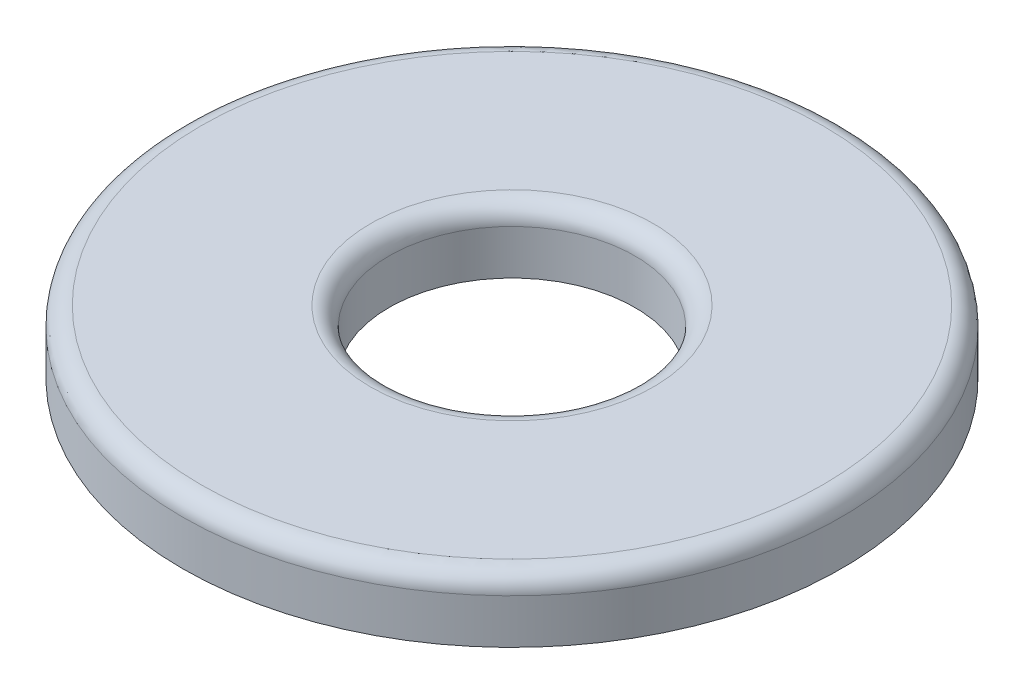
ISO-10303-21;
HEADER;
FILE_DESCRIPTION(('STEP AP214'),'2;1');
FILE_NAME('part.step','',(''),(''),'','','');
FILE_SCHEMA(('AUTOMOTIVE_DESIGN { 1 0 10303 214 1 1 1 1 }'));
ENDSEC;
DATA;
#1=APPLICATION_CONTEXT('core data for automotive mechanical design processes');
#2=APPLICATION_PROTOCOL_DEFINITION('international standard','automotive_design',2000,#1);
#3=PRODUCT_CONTEXT('',#1,'mechanical');
#4=PRODUCT('Part','Part','',(#3));
#5=PRODUCT_RELATED_PRODUCT_CATEGORY('part','',(#4));
#6=PRODUCT_DEFINITION_FORMATION('','',#4);
#7=PRODUCT_DEFINITION_CONTEXT('part definition',#1,'design');
#8=PRODUCT_DEFINITION('design','',#6,#7);
#9=PRODUCT_DEFINITION_SHAPE('','',#8);
#10=(LENGTH_UNIT() NAMED_UNIT(*) SI_UNIT(.MILLI.,.METRE.));
#11=(NAMED_UNIT(*) PLANE_ANGLE_UNIT() SI_UNIT($,.RADIAN.));
#12=(NAMED_UNIT(*) SI_UNIT($,.STERADIAN.) SOLID_ANGLE_UNIT());
#13=UNCERTAINTY_MEASURE_WITH_UNIT(LENGTH_MEASURE(1.E-05),#10,'distance_accuracy_value','');
#14=(GEOMETRIC_REPRESENTATION_CONTEXT(3) GLOBAL_UNCERTAINTY_ASSIGNED_CONTEXT((#13)) GLOBAL_UNIT_ASSIGNED_CONTEXT((#10,
#11,#12)) REPRESENTATION_CONTEXT('',''));
#15=CARTESIAN_POINT('',(0.,0.,0.));
#16=DIRECTION('',(0.,0.,1.));
#17=DIRECTION('',(1.,0.,0.));
#18=AXIS2_PLACEMENT_3D('',#15,#16,#17);
#19=CARTESIAN_POINT('',(0.,2.18452943826526,0.));
#20=DIRECTION('',(0.,1.,0.));
#21=DIRECTION('',(0.,0.,1.));
#22=AXIS2_PLACEMENT_3D('',#19,#20,#21);
#23=CYLINDRICAL_SURFACE('',#22,4.425);
#24=CARTESIAN_POINT('',(0.,0.600000000000001,0.));
#25=DIRECTION('',(0.,1.,0.));
#26=DIRECTION('',(0.,0.,1.));
#27=AXIS2_PLACEMENT_3D('',#24,#25,#26);
#28=CIRCLE('',#27,4.425);
#29=CARTESIAN_POINT('',(0.,0.600000000000001,4.425));
#30=VERTEX_POINT('',#29);
#31=EDGE_CURVE('E10',#30,#30,#28,.T.);
#32=ORIENTED_EDGE('',*,*,#31,.F.);
#33=EDGE_LOOP('',(#32));
#34=FACE_BOUND('',#33,.T.);
#35=CARTESIAN_POINT('',(0.,0.,0.));
#36=DIRECTION('',(0.,1.,0.));
#37=DIRECTION('',(0.,0.,1.));
#38=AXIS2_PLACEMENT_3D('',#35,#36,#37);
#39=CIRCLE('',#38,4.425);
#40=CARTESIAN_POINT('',(0.,0.,4.425));
#41=VERTEX_POINT('',#40);
#42=EDGE_CURVE('E58',#41,#41,#39,.T.);
#43=ORIENTED_EDGE('',*,*,#42,.T.);
#44=EDGE_LOOP('',(#43));
#45=FACE_BOUND('',#44,.T.);
#46=ADVANCED_FACE('F35',(#34,#45),#23,.T.);
#47=CARTESIAN_POINT('',(0.,0.600000000000001,0.));
#48=DIRECTION('',(0.,1.,0.));
#49=DIRECTION('',(0.,0.,1.));
#50=AXIS2_PLACEMENT_3D('',#47,#48,#49);
#51=TOROIDAL_SURFACE('',#50,4.175,0.25);
#52=CARTESIAN_POINT('',(0.,0.85,0.));
#53=DIRECTION('',(0.,1.,0.));
#54=DIRECTION('',(0.,0.,1.));
#55=AXIS2_PLACEMENT_3D('',#52,#53,#54);
#56=CIRCLE('',#55,4.175);
#57=CARTESIAN_POINT('',(0.,0.85,4.175));
#58=VERTEX_POINT('',#57);
#59=EDGE_CURVE('E41',#58,#58,#56,.T.);
#60=ORIENTED_EDGE('',*,*,#59,.F.);
#61=EDGE_LOOP('',(#60));
#62=FACE_BOUND('',#61,.T.);
#63=ORIENTED_EDGE('',*,*,#31,.T.);
#64=EDGE_LOOP('',(#63));
#65=FACE_BOUND('',#64,.T.);
#66=ADVANCED_FACE('F83',(#62,#65),#51,.T.);
#67=CARTESIAN_POINT('',(0.,0.850000000000001,-4.175));
#68=DIRECTION('',(0.,-1.,0.));
#69=DIRECTION('',(0.,0.,-1.));
#70=AXIS2_PLACEMENT_3D('',#67,#68,#69);
#71=PLANE('',#70);
#72=CARTESIAN_POINT('',(0.,0.850000000000001,0.));
#73=DIRECTION('',(0.,1.,0.));
#74=DIRECTION('',(0.,0.,1.));
#75=AXIS2_PLACEMENT_3D('',#72,#73,#74);
#76=CIRCLE('',#75,1.9);
#77=CARTESIAN_POINT('',(0.,0.850000000000001,1.9));
#78=VERTEX_POINT('',#77);
#79=EDGE_CURVE('E45',#78,#78,#76,.T.);
#80=ORIENTED_EDGE('',*,*,#79,.F.);
#81=EDGE_LOOP('',(#80));
#82=FACE_BOUND('',#81,.T.);
#83=ORIENTED_EDGE('',*,*,#59,.T.);
#84=EDGE_LOOP('',(#83));
#85=FACE_BOUND('',#84,.T.);
#86=ADVANCED_FACE('F78',(#82,#85),#71,.F.);
#87=CARTESIAN_POINT('',(0.,0.600000000000001,0.));
#88=DIRECTION('',(0.,1.,0.));
#89=DIRECTION('',(0.,0.,1.));
#90=AXIS2_PLACEMENT_3D('',#87,#88,#89);
#91=TOROIDAL_SURFACE('',#90,1.9,0.25);
#92=CARTESIAN_POINT('',(0.,0.600000000000001,0.));
#93=DIRECTION('',(0.,1.,0.));
#94=DIRECTION('',(0.,0.,1.));
#95=AXIS2_PLACEMENT_3D('',#92,#93,#94);
#96=CIRCLE('',#95,1.65);
#97=CARTESIAN_POINT('',(0.,0.600000000000001,1.65));
#98=VERTEX_POINT('',#97);
#99=EDGE_CURVE('E50',#98,#98,#96,.T.);
#100=ORIENTED_EDGE('',*,*,#99,.F.);
#101=EDGE_LOOP('',(#100));
#102=FACE_BOUND('',#101,.T.);
#103=ORIENTED_EDGE('',*,*,#79,.T.);
#104=EDGE_LOOP('',(#103));
#105=FACE_BOUND('',#104,.T.);
#106=ADVANCED_FACE('F72',(#102,#105),#91,.T.);
#107=CARTESIAN_POINT('',(0.,2.18452943826526,0.));
#108=DIRECTION('',(0.,1.,0.));
#109=DIRECTION('',(0.,0.,1.));
#110=AXIS2_PLACEMENT_3D('',#107,#108,#109);
#111=CYLINDRICAL_SURFACE('',#110,1.65);
#112=CARTESIAN_POINT('',(0.,0.,0.));
#113=DIRECTION('',(0.,1.,0.));
#114=DIRECTION('',(0.,0.,1.));
#115=AXIS2_PLACEMENT_3D('',#112,#113,#114);
#116=CIRCLE('',#115,1.65);
#117=CARTESIAN_POINT('',(0.,0.,1.65));
#118=VERTEX_POINT('',#117);
#119=EDGE_CURVE('E55',#118,#118,#116,.T.);
#120=ORIENTED_EDGE('',*,*,#119,.F.);
#121=EDGE_LOOP('',(#120));
#122=FACE_BOUND('',#121,.T.);
#123=ORIENTED_EDGE('',*,*,#99,.T.);
#124=EDGE_LOOP('',(#123));
#125=FACE_BOUND('',#124,.T.);
#126=ADVANCED_FACE('F66',(#122,#125),#111,.F.);
#127=CARTESIAN_POINT('',(0.,0.,-1.65));
#128=DIRECTION('',(0.,1.,0.));
#129=DIRECTION('',(0.,0.,1.));
#130=AXIS2_PLACEMENT_3D('',#127,#128,#129);
#131=PLANE('',#130);
#132=ORIENTED_EDGE('',*,*,#42,.F.);
#133=EDGE_LOOP('',(#132));
#134=FACE_BOUND('',#133,.T.);
#135=ORIENTED_EDGE('',*,*,#119,.T.);
#136=EDGE_LOOP('',(#135));
#137=FACE_BOUND('',#136,.T.);
#138=ADVANCED_FACE('F63',(#134,#137),#131,.F.);
#139=CLOSED_SHELL('',(#46,#66,#86,#106,#126,#138));
#140=MANIFOLD_SOLID_BREP('B2',#139);
#141=ADVANCED_BREP_SHAPE_REPRESENTATION('',(#18,#140),#14);
#142=SHAPE_DEFINITION_REPRESENTATION(#9,#141);
ENDSEC;
END-ISO-10303-21;
